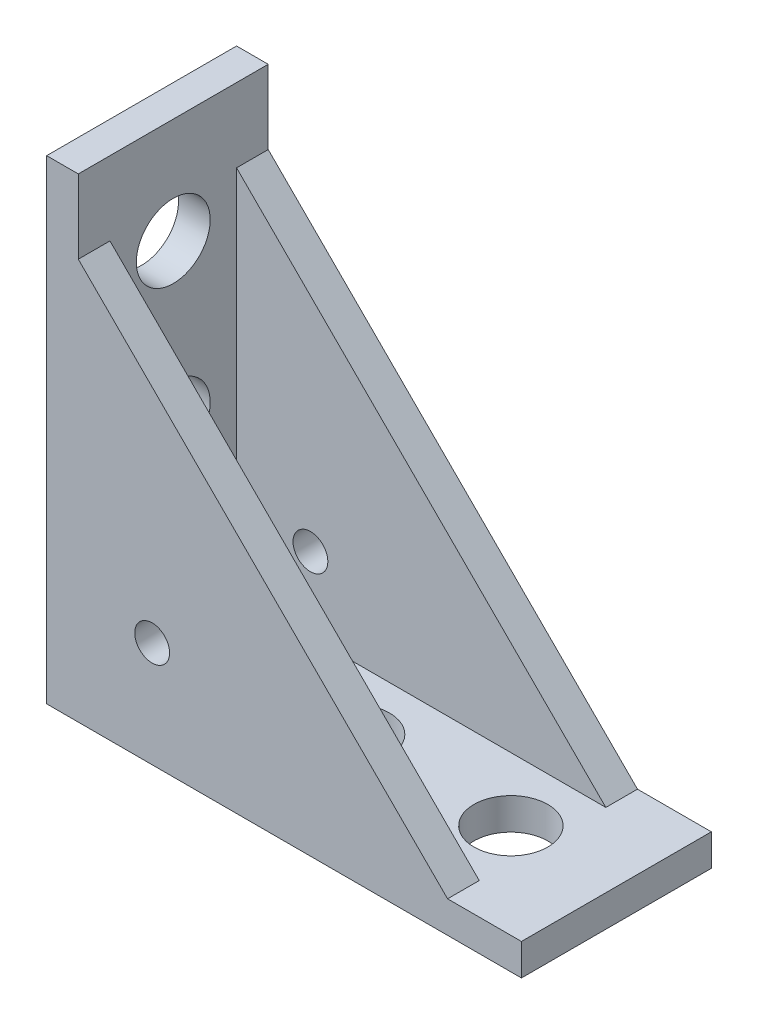
ISO-10303-21;
HEADER;
FILE_DESCRIPTION(('STEP AP214'),'2;1');
FILE_NAME('part.step','',(''),(''),'','','');
FILE_SCHEMA(('AUTOMOTIVE_DESIGN { 1 0 10303 214 1 1 1 1 }'));
ENDSEC;
DATA;
#1=APPLICATION_CONTEXT('core data for automotive mechanical design processes');
#2=APPLICATION_PROTOCOL_DEFINITION('international standard','automotive_design',2000,#1);
#3=PRODUCT_CONTEXT('',#1,'mechanical');
#4=PRODUCT('Part','Part','',(#3));
#5=PRODUCT_RELATED_PRODUCT_CATEGORY('part','',(#4));
#6=PRODUCT_DEFINITION_FORMATION('','',#4);
#7=PRODUCT_DEFINITION_CONTEXT('part definition',#1,'design');
#8=PRODUCT_DEFINITION('design','',#6,#7);
#9=PRODUCT_DEFINITION_SHAPE('','',#8);
#10=(LENGTH_UNIT() NAMED_UNIT(*) SI_UNIT(.MILLI.,.METRE.));
#11=(NAMED_UNIT(*) PLANE_ANGLE_UNIT() SI_UNIT($,.RADIAN.));
#12=(NAMED_UNIT(*) SI_UNIT($,.STERADIAN.) SOLID_ANGLE_UNIT());
#13=UNCERTAINTY_MEASURE_WITH_UNIT(LENGTH_MEASURE(1.E-05),#10,'distance_accuracy_value','');
#14=(GEOMETRIC_REPRESENTATION_CONTEXT(3) GLOBAL_UNCERTAINTY_ASSIGNED_CONTEXT((#13)) GLOBAL_UNIT_ASSIGNED_CONTEXT((#10,
#11,#12)) REPRESENTATION_CONTEXT('',''));
#15=CARTESIAN_POINT('',(0.,0.,0.));
#16=DIRECTION('',(0.,0.,1.));
#17=DIRECTION('',(1.,0.,0.));
#18=AXIS2_PLACEMENT_3D('',#15,#16,#17);
#19=CARTESIAN_POINT('',(3.,38.,9.));
#20=DIRECTION('',(-0.707106781186547,-0.707106781186547,0.));
#21=DIRECTION('',(0.707106781186548,-0.707106781186548,0.));
#22=AXIS2_PLACEMENT_3D('',#19,#20,#21);
#23=PLANE('',#22);
#24=DIRECTION('',(-0.707106781186548,0.707106781186548,0.));
#25=VECTOR('',#24,1.);
#26=CARTESIAN_POINT('',(3.,38.,-6.));
#27=LINE('',#26,#25);
#28=CARTESIAN_POINT('',(38.,3.,-6.));
#29=VERTEX_POINT('',#28);
#30=CARTESIAN_POINT('',(3.,38.,-6.));
#31=VERTEX_POINT('',#30);
#32=EDGE_CURVE('E177',#29,#31,#27,.T.);
#33=ORIENTED_EDGE('',*,*,#32,.F.);
#34=DIRECTION('',(0.,0.,-1.));
#35=VECTOR('',#34,1.);
#36=CARTESIAN_POINT('',(38.,3.,9.));
#37=LINE('',#36,#35);
#38=CARTESIAN_POINT('',(38.,3.,-9.));
#39=VERTEX_POINT('',#38);
#40=EDGE_CURVE('E158',#29,#39,#37,.T.);
#41=ORIENTED_EDGE('',*,*,#40,.T.);
#42=DIRECTION('',(-0.707106781186548,0.707106781186548,0.));
#43=VECTOR('',#42,1.);
#44=CARTESIAN_POINT('',(3.,38.,-9.));
#45=LINE('',#44,#43);
#46=CARTESIAN_POINT('',(3.,38.,-9.));
#47=VERTEX_POINT('',#46);
#48=EDGE_CURVE('E146',#39,#47,#45,.T.);
#49=ORIENTED_EDGE('',*,*,#48,.T.);
#50=DIRECTION('',(0.,0.,-1.));
#51=VECTOR('',#50,1.);
#52=CARTESIAN_POINT('',(3.,38.,9.));
#53=LINE('',#52,#51);
#54=EDGE_CURVE('E128',#31,#47,#53,.T.);
#55=ORIENTED_EDGE('',*,*,#54,.F.);
#56=EDGE_LOOP('',(#33,#41,#49,#55));
#57=FACE_BOUND('',#56,.T.);
#58=ADVANCED_FACE('F34',(#57),#23,.F.);
#59=CARTESIAN_POINT('',(0.,0.,9.));
#60=DIRECTION('',(0.,1.,0.));
#61=DIRECTION('',(0.,0.,1.));
#62=AXIS2_PLACEMENT_3D('',#59,#60,#61);
#63=PLANE('',#62);
#64=CARTESIAN_POINT('',(35.,0.,0.));
#65=DIRECTION('',(0.,1.,0.));
#66=DIRECTION('',(0.,0.,1.));
#67=AXIS2_PLACEMENT_3D('',#64,#65,#66);
#68=CIRCLE('',#67,3.5);
#69=CARTESIAN_POINT('',(35.,0.,3.5));
#70=VERTEX_POINT('',#69);
#71=EDGE_CURVE('E234',#70,#70,#68,.T.);
#72=ORIENTED_EDGE('',*,*,#71,.T.);
#73=EDGE_LOOP('',(#72));
#74=FACE_BOUND('',#73,.T.);
#75=CARTESIAN_POINT('',(20.,0.,0.));
#76=DIRECTION('',(0.,1.,0.));
#77=DIRECTION('',(0.,0.,1.));
#78=AXIS2_PLACEMENT_3D('',#75,#76,#77);
#79=CIRCLE('',#78,3.5);
#80=CARTESIAN_POINT('',(20.,0.,3.5));
#81=VERTEX_POINT('',#80);
#82=EDGE_CURVE('E238',#81,#81,#79,.T.);
#83=ORIENTED_EDGE('',*,*,#82,.T.);
#84=EDGE_LOOP('',(#83));
#85=FACE_BOUND('',#84,.T.);
#86=DIRECTION('',(1.,0.,0.));
#87=VECTOR('',#86,1.);
#88=CARTESIAN_POINT('',(0.,0.,-9.));
#89=LINE('',#88,#87);
#90=CARTESIAN_POINT('',(0.,0.,-9.));
#91=VERTEX_POINT('',#90);
#92=CARTESIAN_POINT('',(45.,0.,-9.));
#93=VERTEX_POINT('',#92);
#94=EDGE_CURVE('E137',#91,#93,#89,.T.);
#95=ORIENTED_EDGE('',*,*,#94,.T.);
#96=DIRECTION('',(0.,0.,-1.));
#97=VECTOR('',#96,1.);
#98=CARTESIAN_POINT('',(45.,0.,9.));
#99=LINE('',#98,#97);
#100=CARTESIAN_POINT('',(45.,0.,9.));
#101=VERTEX_POINT('',#100);
#102=EDGE_CURVE('E11',#101,#93,#99,.T.);
#103=ORIENTED_EDGE('',*,*,#102,.F.);
#104=DIRECTION('',(1.,0.,0.));
#105=VECTOR('',#104,1.);
#106=CARTESIAN_POINT('',(0.,0.,9.));
#107=LINE('',#106,#105);
#108=CARTESIAN_POINT('',(0.,0.,9.));
#109=VERTEX_POINT('',#108);
#110=EDGE_CURVE('E153',#109,#101,#107,.T.);
#111=ORIENTED_EDGE('',*,*,#110,.F.);
#112=DIRECTION('',(0.,0.,-1.));
#113=VECTOR('',#112,1.);
#114=CARTESIAN_POINT('',(0.,0.,9.));
#115=LINE('',#114,#113);
#116=EDGE_CURVE('E133',#109,#91,#115,.T.);
#117=ORIENTED_EDGE('',*,*,#116,.T.);
#118=EDGE_LOOP('',(#95,#103,#111,#117));
#119=FACE_BOUND('',#118,.T.);
#120=ADVANCED_FACE('F36',(#74,#85,#119),#63,.F.);
#121=CARTESIAN_POINT('',(45.,0.,9.));
#122=DIRECTION('',(-1.,0.,0.));
#123=DIRECTION('',(0.,0.,1.));
#124=AXIS2_PLACEMENT_3D('',#121,#122,#123);
#125=PLANE('',#124);
#126=DIRECTION('',(0.,1.,0.));
#127=VECTOR('',#126,1.);
#128=CARTESIAN_POINT('',(45.,0.,-9.));
#129=LINE('',#128,#127);
#130=CARTESIAN_POINT('',(45.,3.,-9.));
#131=VERTEX_POINT('',#130);
#132=EDGE_CURVE('E140',#93,#131,#129,.T.);
#133=ORIENTED_EDGE('',*,*,#132,.T.);
#134=DIRECTION('',(0.,0.,-1.));
#135=VECTOR('',#134,1.);
#136=CARTESIAN_POINT('',(45.,3.,9.));
#137=LINE('',#136,#135);
#138=CARTESIAN_POINT('',(45.,3.,9.));
#139=VERTEX_POINT('',#138);
#140=EDGE_CURVE('E43',#139,#131,#137,.T.);
#141=ORIENTED_EDGE('',*,*,#140,.F.);
#142=DIRECTION('',(0.,1.,0.));
#143=VECTOR('',#142,1.);
#144=CARTESIAN_POINT('',(45.,0.,9.));
#145=LINE('',#144,#143);
#146=EDGE_CURVE('E97',#101,#139,#145,.T.);
#147=ORIENTED_EDGE('',*,*,#146,.F.);
#148=ORIENTED_EDGE('',*,*,#102,.T.);
#149=EDGE_LOOP('',(#133,#141,#147,#148));
#150=FACE_BOUND('',#149,.T.);
#151=ADVANCED_FACE('F220',(#150),#125,.F.);
#152=CARTESIAN_POINT('',(38.,3.,9.));
#153=DIRECTION('',(0.,-1.,0.));
#154=DIRECTION('',(0.,0.,-1.));
#155=AXIS2_PLACEMENT_3D('',#152,#153,#154);
#156=PLANE('',#155);
#157=CARTESIAN_POINT('',(35.,3.,0.));
#158=DIRECTION('',(0.,1.,0.));
#159=DIRECTION('',(0.,0.,1.));
#160=AXIS2_PLACEMENT_3D('',#157,#158,#159);
#161=CIRCLE('',#160,3.5);
#162=CARTESIAN_POINT('',(35.,3.,3.5));
#163=VERTEX_POINT('',#162);
#164=EDGE_CURVE('E312',#163,#163,#161,.T.);
#165=ORIENTED_EDGE('',*,*,#164,.F.);
#166=EDGE_LOOP('',(#165));
#167=FACE_BOUND('',#166,.T.);
#168=CARTESIAN_POINT('',(20.,3.,0.));
#169=DIRECTION('',(0.,1.,0.));
#170=DIRECTION('',(0.,0.,1.));
#171=AXIS2_PLACEMENT_3D('',#168,#169,#170);
#172=CIRCLE('',#171,3.5);
#173=CARTESIAN_POINT('',(20.,3.,3.5));
#174=VERTEX_POINT('',#173);
#175=EDGE_CURVE('E316',#174,#174,#172,.T.);
#176=ORIENTED_EDGE('',*,*,#175,.F.);
#177=EDGE_LOOP('',(#176));
#178=FACE_BOUND('',#177,.T.);
#179=DIRECTION('',(-1.,0.,0.));
#180=VECTOR('',#179,1.);
#181=CARTESIAN_POINT('',(38.,3.,-9.));
#182=LINE('',#181,#180);
#183=EDGE_CURVE('E143',#131,#39,#182,.T.);
#184=ORIENTED_EDGE('',*,*,#183,.T.);
#185=ORIENTED_EDGE('',*,*,#40,.F.);
#186=DIRECTION('',(1.,0.,0.));
#187=VECTOR('',#186,1.);
#188=CARTESIAN_POINT('',(0.,3.,-6.));
#189=LINE('',#188,#187);
#190=CARTESIAN_POINT('',(3.,3.,-6.));
#191=VERTEX_POINT('',#190);
#192=EDGE_CURVE('E181',#191,#29,#189,.T.);
#193=ORIENTED_EDGE('',*,*,#192,.F.);
#194=DIRECTION('',(0.,0.,-1.));
#195=VECTOR('',#194,1.);
#196=CARTESIAN_POINT('',(3.,3.,9.));
#197=LINE('',#196,#195);
#198=CARTESIAN_POINT('',(3.,3.,6.));
#199=VERTEX_POINT('',#198);
#200=EDGE_CURVE('E141',#199,#191,#197,.T.);
#201=ORIENTED_EDGE('',*,*,#200,.F.);
#202=DIRECTION('',(1.,0.,0.));
#203=VECTOR('',#202,1.);
#204=CARTESIAN_POINT('',(0.,3.,6.));
#205=LINE('',#204,#203);
#206=CARTESIAN_POINT('',(38.,3.,6.));
#207=VERTEX_POINT('',#206);
#208=EDGE_CURVE('E50',#199,#207,#205,.T.);
#209=ORIENTED_EDGE('',*,*,#208,.T.);
#210=CARTESIAN_POINT('',(38.,3.,9.));
#211=VERTEX_POINT('',#210);
#212=EDGE_CURVE('E159',#211,#207,#37,.T.);
#213=ORIENTED_EDGE('',*,*,#212,.F.);
#214=DIRECTION('',(-1.,0.,0.));
#215=VECTOR('',#214,1.);
#216=CARTESIAN_POINT('',(38.,3.,9.));
#217=LINE('',#216,#215);
#218=EDGE_CURVE('E168',#139,#211,#217,.T.);
#219=ORIENTED_EDGE('',*,*,#218,.F.);
#220=ORIENTED_EDGE('',*,*,#140,.T.);
#221=EDGE_LOOP('',(#184,#185,#193,#201,#209,#213,#219,#220));
#222=FACE_BOUND('',#221,.T.);
#223=ADVANCED_FACE('F165',(#167,#178,#222),#156,.F.);
#224=ORIENTED_EDGE('',*,*,#212,.T.);
#225=DIRECTION('',(-0.707106781186548,0.707106781186548,0.));
#226=VECTOR('',#225,1.);
#227=CARTESIAN_POINT('',(3.,38.,6.));
#228=LINE('',#227,#226);
#229=CARTESIAN_POINT('',(3.,38.,6.));
#230=VERTEX_POINT('',#229);
#231=EDGE_CURVE('E196',#207,#230,#228,.T.);
#232=ORIENTED_EDGE('',*,*,#231,.T.);
#233=CARTESIAN_POINT('',(3.,38.,9.));
#234=VERTEX_POINT('',#233);
#235=EDGE_CURVE('E156',#234,#230,#53,.T.);
#236=ORIENTED_EDGE('',*,*,#235,.F.);
#237=DIRECTION('',(-0.707106781186548,0.707106781186548,0.));
#238=VECTOR('',#237,1.);
#239=CARTESIAN_POINT('',(3.,38.,9.));
#240=LINE('',#239,#238);
#241=EDGE_CURVE('E116',#211,#234,#240,.T.);
#242=ORIENTED_EDGE('',*,*,#241,.F.);
#243=EDGE_LOOP('',(#224,#232,#236,#242));
#244=FACE_BOUND('',#243,.T.);
#245=ADVANCED_FACE('F211',(#244),#23,.F.);
#246=CARTESIAN_POINT('',(3.,45.,9.));
#247=DIRECTION('',(-1.,0.,0.));
#248=DIRECTION('',(0.,-1.,0.));
#249=AXIS2_PLACEMENT_3D('',#246,#247,#248);
#250=PLANE('',#249);
#251=CARTESIAN_POINT('',(3.,35.,0.));
#252=DIRECTION('',(1.,0.,0.));
#253=DIRECTION('',(0.,1.,0.));
#254=AXIS2_PLACEMENT_3D('',#251,#252,#253);
#255=CIRCLE('',#254,3.5);
#256=CARTESIAN_POINT('',(3.,38.5,0.));
#257=VERTEX_POINT('',#256);
#258=EDGE_CURVE('E303',#257,#257,#255,.T.);
#259=ORIENTED_EDGE('',*,*,#258,.F.);
#260=EDGE_LOOP('',(#259));
#261=FACE_BOUND('',#260,.T.);
#262=CARTESIAN_POINT('',(3.,20.,0.));
#263=DIRECTION('',(1.,0.,0.));
#264=DIRECTION('',(0.,1.,0.));
#265=AXIS2_PLACEMENT_3D('',#262,#263,#264);
#266=CIRCLE('',#265,3.5);
#267=CARTESIAN_POINT('',(3.,23.5,0.));
#268=VERTEX_POINT('',#267);
#269=EDGE_CURVE('E306',#268,#268,#266,.T.);
#270=ORIENTED_EDGE('',*,*,#269,.F.);
#271=EDGE_LOOP('',(#270));
#272=FACE_BOUND('',#271,.T.);
#273=DIRECTION('',(0.,1.,0.));
#274=VECTOR('',#273,1.);
#275=CARTESIAN_POINT('',(3.,45.,-9.));
#276=LINE('',#275,#274);
#277=CARTESIAN_POINT('',(3.,45.,-9.));
#278=VERTEX_POINT('',#277);
#279=EDGE_CURVE('E125',#47,#278,#276,.T.);
#280=ORIENTED_EDGE('',*,*,#279,.T.);
#281=DIRECTION('',(0.,0.,-1.));
#282=VECTOR('',#281,1.);
#283=CARTESIAN_POINT('',(3.,45.,9.));
#284=LINE('',#283,#282);
#285=CARTESIAN_POINT('',(3.,45.,9.));
#286=VERTEX_POINT('',#285);
#287=EDGE_CURVE('E122',#286,#278,#284,.T.);
#288=ORIENTED_EDGE('',*,*,#287,.F.);
#289=DIRECTION('',(0.,1.,0.));
#290=VECTOR('',#289,1.);
#291=CARTESIAN_POINT('',(3.,45.,9.));
#292=LINE('',#291,#290);
#293=EDGE_CURVE('E109',#234,#286,#292,.T.);
#294=ORIENTED_EDGE('',*,*,#293,.F.);
#295=ORIENTED_EDGE('',*,*,#235,.T.);
#296=DIRECTION('',(0.,-1.,0.));
#297=VECTOR('',#296,1.);
#298=CARTESIAN_POINT('',(3.,0.,6.));
#299=LINE('',#298,#297);
#300=EDGE_CURVE('E193',#230,#199,#299,.T.);
#301=ORIENTED_EDGE('',*,*,#300,.T.);
#302=ORIENTED_EDGE('',*,*,#200,.T.);
#303=DIRECTION('',(0.,-1.,0.));
#304=VECTOR('',#303,1.);
#305=CARTESIAN_POINT('',(3.,0.,-6.));
#306=LINE('',#305,#304);
#307=EDGE_CURVE('E200',#31,#191,#306,.T.);
#308=ORIENTED_EDGE('',*,*,#307,.F.);
#309=ORIENTED_EDGE('',*,*,#54,.T.);
#310=EDGE_LOOP('',(#280,#288,#294,#295,#301,#302,#308,#309));
#311=FACE_BOUND('',#310,.T.);
#312=ADVANCED_FACE('F123',(#261,#272,#311),#250,.F.);
#313=CARTESIAN_POINT('',(0.,45.,9.));
#314=DIRECTION('',(0.,-1.,0.));
#315=DIRECTION('',(0.,0.,-1.));
#316=AXIS2_PLACEMENT_3D('',#313,#314,#315);
#317=PLANE('',#316);
#318=DIRECTION('',(-1.,0.,0.));
#319=VECTOR('',#318,1.);
#320=CARTESIAN_POINT('',(0.,45.,-9.));
#321=LINE('',#320,#319);
#322=CARTESIAN_POINT('',(0.,45.,-9.));
#323=VERTEX_POINT('',#322);
#324=EDGE_CURVE('E150',#278,#323,#321,.T.);
#325=ORIENTED_EDGE('',*,*,#324,.T.);
#326=DIRECTION('',(0.,0.,-1.));
#327=VECTOR('',#326,1.);
#328=CARTESIAN_POINT('',(0.,45.,9.));
#329=LINE('',#328,#327);
#330=CARTESIAN_POINT('',(0.,45.,9.));
#331=VERTEX_POINT('',#330);
#332=EDGE_CURVE('E129',#331,#323,#329,.T.);
#333=ORIENTED_EDGE('',*,*,#332,.F.);
#334=DIRECTION('',(-1.,0.,0.));
#335=VECTOR('',#334,1.);
#336=CARTESIAN_POINT('',(0.,45.,9.));
#337=LINE('',#336,#335);
#338=EDGE_CURVE('E113',#286,#331,#337,.T.);
#339=ORIENTED_EDGE('',*,*,#338,.F.);
#340=ORIENTED_EDGE('',*,*,#287,.T.);
#341=EDGE_LOOP('',(#325,#333,#339,#340));
#342=FACE_BOUND('',#341,.T.);
#343=ADVANCED_FACE('F131',(#342),#317,.F.);
#344=CARTESIAN_POINT('',(0.,0.,9.));
#345=DIRECTION('',(1.,0.,0.));
#346=DIRECTION('',(0.,0.,-1.));
#347=AXIS2_PLACEMENT_3D('',#344,#345,#346);
#348=PLANE('',#347);
#349=CARTESIAN_POINT('',(0.,35.,0.));
#350=DIRECTION('',(1.,0.,0.));
#351=DIRECTION('',(0.,1.,0.));
#352=AXIS2_PLACEMENT_3D('',#349,#350,#351);
#353=CIRCLE('',#352,3.5);
#354=CARTESIAN_POINT('',(0.,38.5,0.));
#355=VERTEX_POINT('',#354);
#356=EDGE_CURVE('E304',#355,#355,#353,.T.);
#357=ORIENTED_EDGE('',*,*,#356,.T.);
#358=EDGE_LOOP('',(#357));
#359=FACE_BOUND('',#358,.T.);
#360=CARTESIAN_POINT('',(0.,20.,0.));
#361=DIRECTION('',(1.,0.,0.));
#362=DIRECTION('',(0.,1.,0.));
#363=AXIS2_PLACEMENT_3D('',#360,#361,#362);
#364=CIRCLE('',#363,3.5);
#365=CARTESIAN_POINT('',(0.,23.5,0.));
#366=VERTEX_POINT('',#365);
#367=EDGE_CURVE('E309',#366,#366,#364,.T.);
#368=ORIENTED_EDGE('',*,*,#367,.T.);
#369=EDGE_LOOP('',(#368));
#370=FACE_BOUND('',#369,.T.);
#371=DIRECTION('',(0.,-1.,0.));
#372=VECTOR('',#371,1.);
#373=CARTESIAN_POINT('',(0.,0.,-9.));
#374=LINE('',#373,#372);
#375=EDGE_CURVE('E89',#323,#91,#374,.T.);
#376=ORIENTED_EDGE('',*,*,#375,.T.);
#377=ORIENTED_EDGE('',*,*,#116,.F.);
#378=DIRECTION('',(0.,-1.,0.));
#379=VECTOR('',#378,1.);
#380=CARTESIAN_POINT('',(0.,0.,9.));
#381=LINE('',#380,#379);
#382=EDGE_CURVE('E59',#331,#109,#381,.T.);
#383=ORIENTED_EDGE('',*,*,#382,.F.);
#384=ORIENTED_EDGE('',*,*,#332,.T.);
#385=EDGE_LOOP('',(#376,#377,#383,#384));
#386=FACE_BOUND('',#385,.T.);
#387=ADVANCED_FACE('F241',(#359,#370,#386),#348,.F.);
#388=CARTESIAN_POINT('',(45.,0.,9.));
#389=DIRECTION('',(0.,0.,1.));
#390=DIRECTION('',(1.,0.,0.));
#391=AXIS2_PLACEMENT_3D('',#388,#389,#390);
#392=PLANE('',#391);
#393=CARTESIAN_POINT('',(10.,10.,9.));
#394=DIRECTION('',(0.,0.,-1.));
#395=DIRECTION('',(-1.,0.,0.));
#396=AXIS2_PLACEMENT_3D('',#393,#394,#395);
#397=CIRCLE('',#396,1.65);
#398=CARTESIAN_POINT('',(8.35,10.,9.));
#399=VERTEX_POINT('',#398);
#400=EDGE_CURVE('E295',#399,#399,#397,.T.);
#401=ORIENTED_EDGE('',*,*,#400,.T.);
#402=EDGE_LOOP('',(#401));
#403=FACE_BOUND('',#402,.T.);
#404=ORIENTED_EDGE('',*,*,#110,.T.);
#405=ORIENTED_EDGE('',*,*,#146,.T.);
#406=ORIENTED_EDGE('',*,*,#218,.T.);
#407=ORIENTED_EDGE('',*,*,#241,.T.);
#408=ORIENTED_EDGE('',*,*,#293,.T.);
#409=ORIENTED_EDGE('',*,*,#338,.T.);
#410=ORIENTED_EDGE('',*,*,#382,.T.);
#411=EDGE_LOOP('',(#404,#405,#406,#407,#408,#409,#410));
#412=FACE_BOUND('',#411,.T.);
#413=ADVANCED_FACE('F111',(#403,#412),#392,.T.);
#414=CARTESIAN_POINT('',(45.,0.,-9.));
#415=DIRECTION('',(0.,0.,1.));
#416=DIRECTION('',(1.,0.,0.));
#417=AXIS2_PLACEMENT_3D('',#414,#415,#416);
#418=PLANE('',#417);
#419=CARTESIAN_POINT('',(10.,10.,-9.));
#420=DIRECTION('',(0.,0.,-1.));
#421=DIRECTION('',(-1.,0.,0.));
#422=AXIS2_PLACEMENT_3D('',#419,#420,#421);
#423=CIRCLE('',#422,1.65);
#424=CARTESIAN_POINT('',(8.35,10.,-9.));
#425=VERTEX_POINT('',#424);
#426=EDGE_CURVE('E294',#425,#425,#423,.T.);
#427=ORIENTED_EDGE('',*,*,#426,.F.);
#428=EDGE_LOOP('',(#427));
#429=FACE_BOUND('',#428,.T.);
#430=ORIENTED_EDGE('',*,*,#94,.F.);
#431=ORIENTED_EDGE('',*,*,#375,.F.);
#432=ORIENTED_EDGE('',*,*,#324,.F.);
#433=ORIENTED_EDGE('',*,*,#279,.F.);
#434=ORIENTED_EDGE('',*,*,#48,.F.);
#435=ORIENTED_EDGE('',*,*,#183,.F.);
#436=ORIENTED_EDGE('',*,*,#132,.F.);
#437=EDGE_LOOP('',(#430,#431,#432,#433,#434,#435,#436));
#438=FACE_BOUND('',#437,.T.);
#439=ADVANCED_FACE('F171',(#429,#438),#418,.F.);
#440=CARTESIAN_POINT('',(45.,0.,6.));
#441=DIRECTION('',(0.,0.,1.));
#442=DIRECTION('',(1.,0.,0.));
#443=AXIS2_PLACEMENT_3D('',#440,#441,#442);
#444=PLANE('',#443);
#445=CARTESIAN_POINT('',(10.,10.,6.));
#446=DIRECTION('',(0.,0.,1.));
#447=DIRECTION('',(1.,0.,0.));
#448=AXIS2_PLACEMENT_3D('',#445,#446,#447);
#449=CIRCLE('',#448,1.65);
#450=CARTESIAN_POINT('',(11.65,10.,6.));
#451=VERTEX_POINT('',#450);
#452=EDGE_CURVE('E300',#451,#451,#449,.T.);
#453=ORIENTED_EDGE('',*,*,#452,.T.);
#454=EDGE_LOOP('',(#453));
#455=FACE_BOUND('',#454,.T.);
#456=ORIENTED_EDGE('',*,*,#208,.F.);
#457=ORIENTED_EDGE('',*,*,#300,.F.);
#458=ORIENTED_EDGE('',*,*,#231,.F.);
#459=EDGE_LOOP('',(#456,#457,#458));
#460=FACE_BOUND('',#459,.T.);
#461=ADVANCED_FACE('F199',(#455,#460),#444,.F.);
#462=CARTESIAN_POINT('',(45.,0.,-6.));
#463=DIRECTION('',(0.,0.,1.));
#464=DIRECTION('',(1.,0.,0.));
#465=AXIS2_PLACEMENT_3D('',#462,#463,#464);
#466=PLANE('',#465);
#467=CARTESIAN_POINT('',(10.,10.,-6.));
#468=DIRECTION('',(0.,0.,1.));
#469=DIRECTION('',(1.,0.,0.));
#470=AXIS2_PLACEMENT_3D('',#467,#468,#469);
#471=CIRCLE('',#470,1.65);
#472=CARTESIAN_POINT('',(11.65,10.,-6.));
#473=VERTEX_POINT('',#472);
#474=EDGE_CURVE('E38',#473,#473,#471,.T.);
#475=ORIENTED_EDGE('',*,*,#474,.F.);
#476=EDGE_LOOP('',(#475));
#477=FACE_BOUND('',#476,.T.);
#478=ORIENTED_EDGE('',*,*,#32,.T.);
#479=ORIENTED_EDGE('',*,*,#307,.T.);
#480=ORIENTED_EDGE('',*,*,#192,.T.);
#481=EDGE_LOOP('',(#478,#479,#480));
#482=FACE_BOUND('',#481,.T.);
#483=ADVANCED_FACE('F258',(#477,#482),#466,.T.);
#484=CARTESIAN_POINT('',(20.,0.,0.));
#485=DIRECTION('',(0.,1.,0.));
#486=DIRECTION('',(0.,0.,1.));
#487=AXIS2_PLACEMENT_3D('',#484,#485,#486);
#488=CYLINDRICAL_SURFACE('',#487,3.5);
#489=ORIENTED_EDGE('',*,*,#82,.F.);
#490=EDGE_LOOP('',(#489));
#491=FACE_BOUND('',#490,.T.);
#492=ORIENTED_EDGE('',*,*,#175,.T.);
#493=EDGE_LOOP('',(#492));
#494=FACE_BOUND('',#493,.T.);
#495=ADVANCED_FACE('F261',(#491,#494),#488,.F.);
#496=CARTESIAN_POINT('',(35.,0.,0.));
#497=DIRECTION('',(0.,1.,0.));
#498=DIRECTION('',(0.,0.,1.));
#499=AXIS2_PLACEMENT_3D('',#496,#497,#498);
#500=CYLINDRICAL_SURFACE('',#499,3.5);
#501=ORIENTED_EDGE('',*,*,#71,.F.);
#502=EDGE_LOOP('',(#501));
#503=FACE_BOUND('',#502,.T.);
#504=ORIENTED_EDGE('',*,*,#164,.T.);
#505=EDGE_LOOP('',(#504));
#506=FACE_BOUND('',#505,.T.);
#507=ADVANCED_FACE('F268',(#503,#506),#500,.F.);
#508=CARTESIAN_POINT('',(0.,20.,0.));
#509=DIRECTION('',(1.,0.,0.));
#510=DIRECTION('',(0.,1.,0.));
#511=AXIS2_PLACEMENT_3D('',#508,#509,#510);
#512=CYLINDRICAL_SURFACE('',#511,3.5);
#513=ORIENTED_EDGE('',*,*,#367,.F.);
#514=EDGE_LOOP('',(#513));
#515=FACE_BOUND('',#514,.T.);
#516=ORIENTED_EDGE('',*,*,#269,.T.);
#517=EDGE_LOOP('',(#516));
#518=FACE_BOUND('',#517,.T.);
#519=ADVANCED_FACE('F272',(#515,#518),#512,.F.);
#520=CARTESIAN_POINT('',(0.,35.,0.));
#521=DIRECTION('',(1.,0.,0.));
#522=DIRECTION('',(0.,1.,0.));
#523=AXIS2_PLACEMENT_3D('',#520,#521,#522);
#524=CYLINDRICAL_SURFACE('',#523,3.5);
#525=ORIENTED_EDGE('',*,*,#356,.F.);
#526=EDGE_LOOP('',(#525));
#527=FACE_BOUND('',#526,.T.);
#528=ORIENTED_EDGE('',*,*,#258,.T.);
#529=EDGE_LOOP('',(#528));
#530=FACE_BOUND('',#529,.T.);
#531=ADVANCED_FACE('F276',(#527,#530),#524,.F.);
#532=CARTESIAN_POINT('',(10.,10.,-9.));
#533=DIRECTION('',(0.,0.,-1.));
#534=DIRECTION('',(-1.,0.,0.));
#535=AXIS2_PLACEMENT_3D('',#532,#533,#534);
#536=CYLINDRICAL_SURFACE('',#535,1.65);
#537=ORIENTED_EDGE('',*,*,#474,.T.);
#538=EDGE_LOOP('',(#537));
#539=FACE_BOUND('',#538,.T.);
#540=ORIENTED_EDGE('',*,*,#426,.T.);
#541=EDGE_LOOP('',(#540));
#542=FACE_BOUND('',#541,.T.);
#543=ADVANCED_FACE('F280',(#539,#542),#536,.F.);
#544=ORIENTED_EDGE('',*,*,#400,.F.);
#545=EDGE_LOOP('',(#544));
#546=FACE_BOUND('',#545,.T.);
#547=ORIENTED_EDGE('',*,*,#452,.F.);
#548=EDGE_LOOP('',(#547));
#549=FACE_BOUND('',#548,.T.);
#550=ADVANCED_FACE('F283',(#546,#549),#536,.F.);
#551=CLOSED_SHELL('',(#58,#120,#151,#223,#245,#312,#343,#387,#413,#439,#461,#483,#495,#507,#519,
#531,#543,#550));
#552=MANIFOLD_SOLID_BREP('B2',#551);
#553=ADVANCED_BREP_SHAPE_REPRESENTATION('',(#18,#552),#14);
#554=SHAPE_DEFINITION_REPRESENTATION(#9,#553);
ENDSEC;
END-ISO-10303-21;
